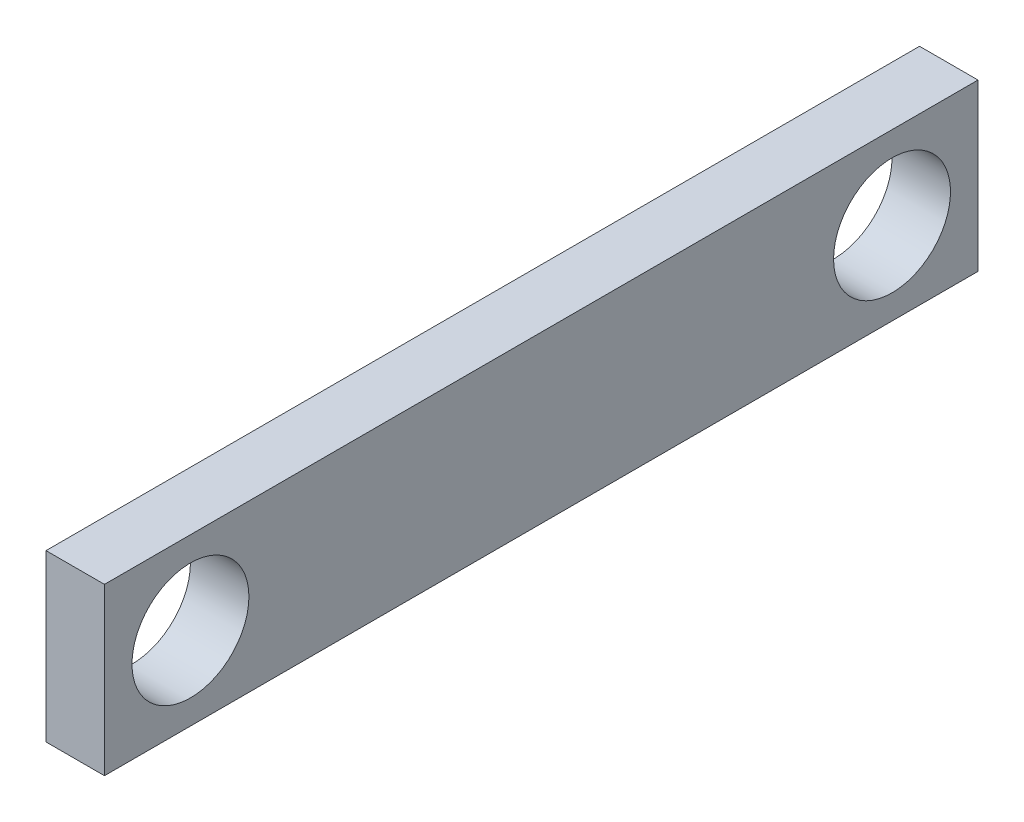
ISO-10303-21;
HEADER;
FILE_DESCRIPTION(('STEP AP214'),'2;1');
FILE_NAME('part.step','',(''),(''),'','','');
FILE_SCHEMA(('AUTOMOTIVE_DESIGN { 1 0 10303 214 1 1 1 1 }'));
ENDSEC;
DATA;
#1=APPLICATION_CONTEXT('core data for automotive mechanical design processes');
#2=APPLICATION_PROTOCOL_DEFINITION('international standard','automotive_design',2000,#1);
#3=PRODUCT_CONTEXT('',#1,'mechanical');
#4=PRODUCT('Part','Part','',(#3));
#5=PRODUCT_RELATED_PRODUCT_CATEGORY('part','',(#4));
#6=PRODUCT_DEFINITION_FORMATION('','',#4);
#7=PRODUCT_DEFINITION_CONTEXT('part definition',#1,'design');
#8=PRODUCT_DEFINITION('design','',#6,#7);
#9=PRODUCT_DEFINITION_SHAPE('','',#8);
#10=(LENGTH_UNIT() NAMED_UNIT(*) SI_UNIT(.MILLI.,.METRE.));
#11=(NAMED_UNIT(*) PLANE_ANGLE_UNIT() SI_UNIT($,.RADIAN.));
#12=(NAMED_UNIT(*) SI_UNIT($,.STERADIAN.) SOLID_ANGLE_UNIT());
#13=UNCERTAINTY_MEASURE_WITH_UNIT(LENGTH_MEASURE(1.E-05),#10,'distance_accuracy_value','');
#14=(GEOMETRIC_REPRESENTATION_CONTEXT(3) GLOBAL_UNCERTAINTY_ASSIGNED_CONTEXT((#13)) GLOBAL_UNIT_ASSIGNED_CONTEXT((#10,
#11,#12)) REPRESENTATION_CONTEXT('',''));
#15=CARTESIAN_POINT('',(0.,0.,0.));
#16=DIRECTION('',(0.,0.,1.));
#17=DIRECTION('',(1.,0.,0.));
#18=AXIS2_PLACEMENT_3D('',#15,#16,#17);
#19=CARTESIAN_POINT('',(2.,0.,0.));
#20=DIRECTION('',(-1.,0.,0.));
#21=DIRECTION('',(0.,0.,1.));
#22=AXIS2_PLACEMENT_3D('',#19,#20,#21);
#23=PLANE('',#22);
#24=DIRECTION('',(0.,1.,0.));
#25=VECTOR('',#24,1.);
#26=CARTESIAN_POINT('',(2.,-2.8348134991119,-14.9413854351687));
#27=LINE('',#26,#25);
#28=CARTESIAN_POINT('',(2.,-2.8348134991119,-14.9413854351687));
#29=VERTEX_POINT('',#28);
#30=CARTESIAN_POINT('',(2.,2.8348134991119,-14.9413854351687));
#31=VERTEX_POINT('',#30);
#32=EDGE_CURVE('E98',#29,#31,#27,.T.);
#33=ORIENTED_EDGE('',*,*,#32,.T.);
#34=DIRECTION('',(0.,0.,1.));
#35=VECTOR('',#34,1.);
#36=CARTESIAN_POINT('',(2.,2.8348134991119,14.9413854351687));
#37=LINE('',#36,#35);
#38=CARTESIAN_POINT('',(2.,2.8348134991119,14.9413854351687));
#39=VERTEX_POINT('',#38);
#40=EDGE_CURVE('E93',#31,#39,#37,.T.);
#41=ORIENTED_EDGE('',*,*,#40,.T.);
#42=DIRECTION('',(0.,-1.,0.));
#43=VECTOR('',#42,1.);
#44=CARTESIAN_POINT('',(2.,-2.8348134991119,14.9413854351687));
#45=LINE('',#44,#43);
#46=CARTESIAN_POINT('',(2.,-2.8348134991119,14.9413854351687));
#47=VERTEX_POINT('',#46);
#48=EDGE_CURVE('E96',#39,#47,#45,.T.);
#49=ORIENTED_EDGE('',*,*,#48,.T.);
#50=DIRECTION('',(0.,0.,-1.));
#51=VECTOR('',#50,1.);
#52=CARTESIAN_POINT('',(2.,-2.8348134991119,14.9413854351687));
#53=LINE('',#52,#51);
#54=EDGE_CURVE('E63',#47,#29,#53,.T.);
#55=ORIENTED_EDGE('',*,*,#54,.T.);
#56=EDGE_LOOP('',(#33,#41,#49,#55));
#57=FACE_BOUND('',#56,.T.);
#58=CARTESIAN_POINT('',(2.,0.,12.));
#59=DIRECTION('',(1.,0.,0.));
#60=DIRECTION('',(0.,0.,-1.));
#61=AXIS2_PLACEMENT_3D('',#58,#59,#60);
#62=CIRCLE('',#61,2.);
#63=CARTESIAN_POINT('',(2.,0.,10.));
#64=VERTEX_POINT('',#63);
#65=EDGE_CURVE('E118',#64,#64,#62,.T.);
#66=ORIENTED_EDGE('',*,*,#65,.F.);
#67=EDGE_LOOP('',(#66));
#68=FACE_BOUND('',#67,.T.);
#69=CARTESIAN_POINT('',(2.,0.,-12.));
#70=DIRECTION('',(1.,0.,0.));
#71=DIRECTION('',(0.,0.,1.));
#72=AXIS2_PLACEMENT_3D('',#69,#70,#71);
#73=CIRCLE('',#72,2.);
#74=CARTESIAN_POINT('',(2.,0.,-10.));
#75=VERTEX_POINT('',#74);
#76=EDGE_CURVE('E140',#75,#75,#73,.T.);
#77=ORIENTED_EDGE('',*,*,#76,.F.);
#78=EDGE_LOOP('',(#77));
#79=FACE_BOUND('',#78,.T.);
#80=ADVANCED_FACE('F45',(#57,#68,#79),#23,.F.);
#81=CARTESIAN_POINT('',(0.,0.,0.));
#82=DIRECTION('',(-1.,0.,0.));
#83=DIRECTION('',(0.,0.,1.));
#84=AXIS2_PLACEMENT_3D('',#81,#82,#83);
#85=PLANE('',#84);
#86=CARTESIAN_POINT('',(0.,0.,12.));
#87=DIRECTION('',(1.,0.,0.));
#88=DIRECTION('',(0.,0.,-1.));
#89=AXIS2_PLACEMENT_3D('',#86,#87,#88);
#90=CIRCLE('',#89,2.);
#91=CARTESIAN_POINT('',(0.,0.,10.));
#92=VERTEX_POINT('',#91);
#93=EDGE_CURVE('E136',#92,#92,#90,.T.);
#94=ORIENTED_EDGE('',*,*,#93,.T.);
#95=EDGE_LOOP('',(#94));
#96=FACE_BOUND('',#95,.T.);
#97=DIRECTION('',(0.,1.,0.));
#98=VECTOR('',#97,1.);
#99=CARTESIAN_POINT('',(0.,-2.8348134991119,-14.9413854351687));
#100=LINE('',#99,#98);
#101=CARTESIAN_POINT('',(0.,-2.8348134991119,-14.9413854351687));
#102=VERTEX_POINT('',#101);
#103=CARTESIAN_POINT('',(0.,2.8348134991119,-14.9413854351687));
#104=VERTEX_POINT('',#103);
#105=EDGE_CURVE('E114',#102,#104,#100,.T.);
#106=ORIENTED_EDGE('',*,*,#105,.F.);
#107=DIRECTION('',(0.,0.,-1.));
#108=VECTOR('',#107,1.);
#109=CARTESIAN_POINT('',(0.,-2.8348134991119,14.9413854351687));
#110=LINE('',#109,#108);
#111=CARTESIAN_POINT('',(0.,-2.8348134991119,14.9413854351687));
#112=VERTEX_POINT('',#111);
#113=EDGE_CURVE('E86',#112,#102,#110,.T.);
#114=ORIENTED_EDGE('',*,*,#113,.F.);
#115=DIRECTION('',(0.,-1.,0.));
#116=VECTOR('',#115,1.);
#117=CARTESIAN_POINT('',(0.,-2.8348134991119,14.9413854351687));
#118=LINE('',#117,#116);
#119=CARTESIAN_POINT('',(0.,2.8348134991119,14.9413854351687));
#120=VERTEX_POINT('',#119);
#121=EDGE_CURVE('E80',#120,#112,#118,.T.);
#122=ORIENTED_EDGE('',*,*,#121,.F.);
#123=DIRECTION('',(0.,0.,1.));
#124=VECTOR('',#123,1.);
#125=CARTESIAN_POINT('',(0.,2.8348134991119,14.9413854351687));
#126=LINE('',#125,#124);
#127=EDGE_CURVE('E103',#104,#120,#126,.T.);
#128=ORIENTED_EDGE('',*,*,#127,.F.);
#129=EDGE_LOOP('',(#106,#114,#122,#128));
#130=FACE_BOUND('',#129,.T.);
#131=CARTESIAN_POINT('',(0.,0.,-12.));
#132=DIRECTION('',(1.,0.,0.));
#133=DIRECTION('',(0.,0.,1.));
#134=AXIS2_PLACEMENT_3D('',#131,#132,#133);
#135=CIRCLE('',#134,2.);
#136=CARTESIAN_POINT('',(0.,0.,-10.));
#137=VERTEX_POINT('',#136);
#138=EDGE_CURVE('E144',#137,#137,#135,.T.);
#139=ORIENTED_EDGE('',*,*,#138,.T.);
#140=EDGE_LOOP('',(#139));
#141=FACE_BOUND('',#140,.T.);
#142=ADVANCED_FACE('F131',(#96,#130,#141),#85,.T.);
#143=CARTESIAN_POINT('',(2.,-2.8348134991119,-14.9413854351687));
#144=DIRECTION('',(0.,0.,1.));
#145=DIRECTION('',(1.,0.,0.));
#146=AXIS2_PLACEMENT_3D('',#143,#144,#145);
#147=PLANE('',#146);
#148=ORIENTED_EDGE('',*,*,#105,.T.);
#149=DIRECTION('',(-1.,0.,0.));
#150=VECTOR('',#149,1.);
#151=CARTESIAN_POINT('',(2.,2.8348134991119,-14.9413854351687));
#152=LINE('',#151,#150);
#153=EDGE_CURVE('E11',#31,#104,#152,.T.);
#154=ORIENTED_EDGE('',*,*,#153,.F.);
#155=ORIENTED_EDGE('',*,*,#32,.F.);
#156=DIRECTION('',(-1.,0.,0.));
#157=VECTOR('',#156,1.);
#158=CARTESIAN_POINT('',(2.,-2.8348134991119,-14.9413854351687));
#159=LINE('',#158,#157);
#160=EDGE_CURVE('E110',#29,#102,#159,.T.);
#161=ORIENTED_EDGE('',*,*,#160,.T.);
#162=EDGE_LOOP('',(#148,#154,#155,#161));
#163=FACE_BOUND('',#162,.T.);
#164=ADVANCED_FACE('F47',(#163),#147,.F.);
#165=CARTESIAN_POINT('',(2.,2.8348134991119,14.9413854351687));
#166=DIRECTION('',(0.,-1.,0.));
#167=DIRECTION('',(0.,0.,-1.));
#168=AXIS2_PLACEMENT_3D('',#165,#166,#167);
#169=PLANE('',#168);
#170=ORIENTED_EDGE('',*,*,#127,.T.);
#171=DIRECTION('',(-1.,0.,0.));
#172=VECTOR('',#171,1.);
#173=CARTESIAN_POINT('',(2.,2.8348134991119,14.9413854351687));
#174=LINE('',#173,#172);
#175=EDGE_CURVE('E55',#39,#120,#174,.T.);
#176=ORIENTED_EDGE('',*,*,#175,.F.);
#177=ORIENTED_EDGE('',*,*,#40,.F.);
#178=ORIENTED_EDGE('',*,*,#153,.T.);
#179=EDGE_LOOP('',(#170,#176,#177,#178));
#180=FACE_BOUND('',#179,.T.);
#181=ADVANCED_FACE('F102',(#180),#169,.F.);
#182=CARTESIAN_POINT('',(2.,-2.8348134991119,14.9413854351687));
#183=DIRECTION('',(0.,0.,-1.));
#184=DIRECTION('',(-1.,0.,0.));
#185=AXIS2_PLACEMENT_3D('',#182,#183,#184);
#186=PLANE('',#185);
#187=ORIENTED_EDGE('',*,*,#121,.T.);
#188=DIRECTION('',(-1.,0.,0.));
#189=VECTOR('',#188,1.);
#190=CARTESIAN_POINT('',(2.,-2.8348134991119,14.9413854351687));
#191=LINE('',#190,#189);
#192=EDGE_CURVE('E105',#47,#112,#191,.T.);
#193=ORIENTED_EDGE('',*,*,#192,.F.);
#194=ORIENTED_EDGE('',*,*,#48,.F.);
#195=ORIENTED_EDGE('',*,*,#175,.T.);
#196=EDGE_LOOP('',(#187,#193,#194,#195));
#197=FACE_BOUND('',#196,.T.);
#198=ADVANCED_FACE('F106',(#197),#186,.F.);
#199=CARTESIAN_POINT('',(2.,-2.8348134991119,14.9413854351687));
#200=DIRECTION('',(0.,1.,0.));
#201=DIRECTION('',(0.,0.,1.));
#202=AXIS2_PLACEMENT_3D('',#199,#200,#201);
#203=PLANE('',#202);
#204=ORIENTED_EDGE('',*,*,#113,.T.);
#205=ORIENTED_EDGE('',*,*,#160,.F.);
#206=ORIENTED_EDGE('',*,*,#54,.F.);
#207=ORIENTED_EDGE('',*,*,#192,.T.);
#208=EDGE_LOOP('',(#204,#205,#206,#207));
#209=FACE_BOUND('',#208,.T.);
#210=ADVANCED_FACE('F128',(#209),#203,.F.);
#211=CARTESIAN_POINT('',(2.,0.,12.));
#212=DIRECTION('',(-1.,0.,0.));
#213=DIRECTION('',(0.,0.,1.));
#214=AXIS2_PLACEMENT_3D('',#211,#212,#213);
#215=CYLINDRICAL_SURFACE('',#214,2.);
#216=ORIENTED_EDGE('',*,*,#65,.T.);
#217=EDGE_LOOP('',(#216));
#218=FACE_BOUND('',#217,.T.);
#219=ORIENTED_EDGE('',*,*,#93,.F.);
#220=EDGE_LOOP('',(#219));
#221=FACE_BOUND('',#220,.T.);
#222=ADVANCED_FACE('F163',(#218,#221),#215,.F.);
#223=CARTESIAN_POINT('',(2.,0.,-12.));
#224=DIRECTION('',(-1.,0.,0.));
#225=DIRECTION('',(0.,0.,1.));
#226=AXIS2_PLACEMENT_3D('',#223,#224,#225);
#227=CYLINDRICAL_SURFACE('',#226,2.);
#228=ORIENTED_EDGE('',*,*,#76,.T.);
#229=EDGE_LOOP('',(#228));
#230=FACE_BOUND('',#229,.T.);
#231=ORIENTED_EDGE('',*,*,#138,.F.);
#232=EDGE_LOOP('',(#231));
#233=FACE_BOUND('',#232,.T.);
#234=ADVANCED_FACE('F152',(#230,#233),#227,.F.);
#235=CLOSED_SHELL('',(#80,#142,#164,#181,#198,#210,#222,#234));
#236=MANIFOLD_SOLID_BREP('B2',#235);
#237=ADVANCED_BREP_SHAPE_REPRESENTATION('',(#18,#236),#14);
#238=SHAPE_DEFINITION_REPRESENTATION(#9,#237);
ENDSEC;
END-ISO-10303-21;
